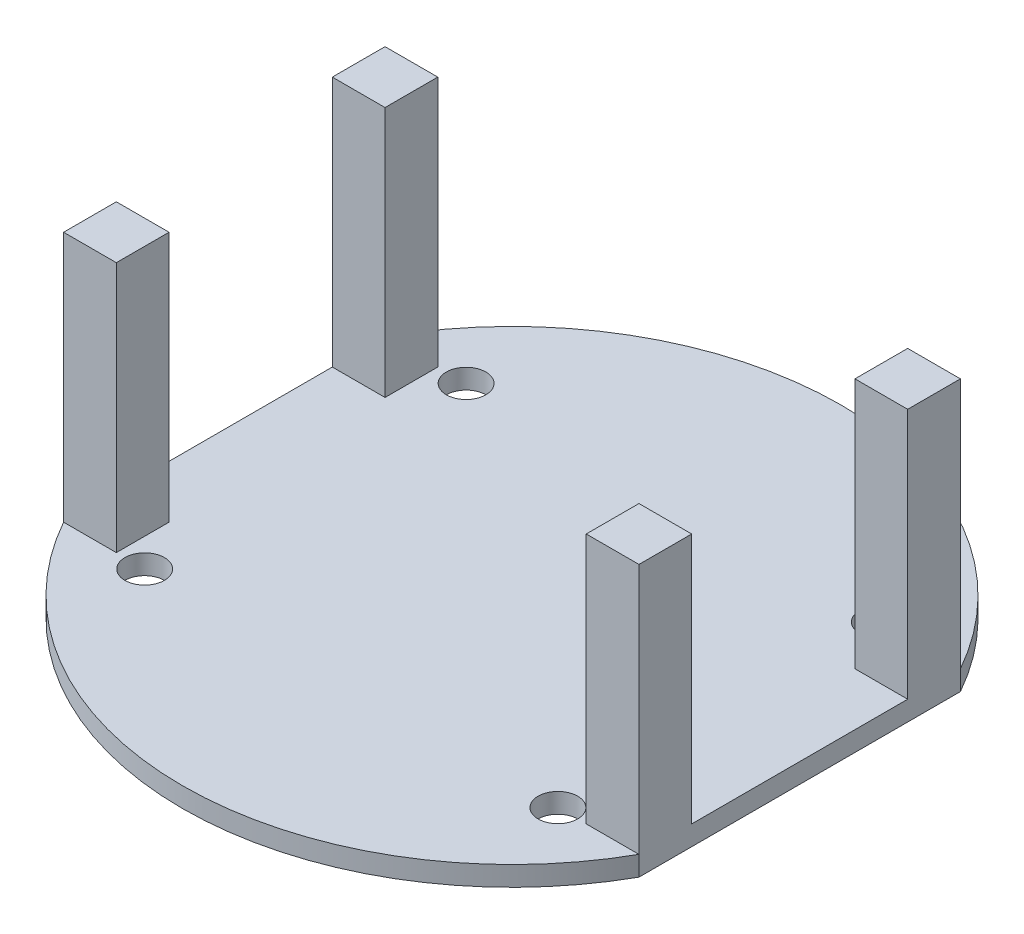
ISO-10303-21;
HEADER;
FILE_DESCRIPTION(('STEP AP214'),'2;1');
FILE_NAME('part.step','',(''),(''),'','','');
FILE_SCHEMA(('AUTOMOTIVE_DESIGN { 1 0 10303 214 1 1 1 1 }'));
ENDSEC;
DATA;
#1=APPLICATION_CONTEXT('core data for automotive mechanical design processes');
#2=APPLICATION_PROTOCOL_DEFINITION('international standard','automotive_design',2000,#1);
#3=PRODUCT_CONTEXT('',#1,'mechanical');
#4=PRODUCT('Part','Part','',(#3));
#5=PRODUCT_RELATED_PRODUCT_CATEGORY('part','',(#4));
#6=PRODUCT_DEFINITION_FORMATION('','',#4);
#7=PRODUCT_DEFINITION_CONTEXT('part definition',#1,'design');
#8=PRODUCT_DEFINITION('design','',#6,#7);
#9=PRODUCT_DEFINITION_SHAPE('','',#8);
#10=(LENGTH_UNIT() NAMED_UNIT(*) SI_UNIT(.MILLI.,.METRE.));
#11=(NAMED_UNIT(*) PLANE_ANGLE_UNIT() SI_UNIT($,.RADIAN.));
#12=(NAMED_UNIT(*) SI_UNIT($,.STERADIAN.) SOLID_ANGLE_UNIT());
#13=UNCERTAINTY_MEASURE_WITH_UNIT(LENGTH_MEASURE(1.E-05),#10,'distance_accuracy_value','');
#14=(GEOMETRIC_REPRESENTATION_CONTEXT(3) GLOBAL_UNCERTAINTY_ASSIGNED_CONTEXT((#13)) GLOBAL_UNIT_ASSIGNED_CONTEXT((#10,
#11,#12)) REPRESENTATION_CONTEXT('',''));
#15=CARTESIAN_POINT('',(0.,0.,0.));
#16=DIRECTION('',(0.,0.,1.));
#17=DIRECTION('',(1.,0.,0.));
#18=AXIS2_PLACEMENT_3D('',#15,#16,#17);
#19=CARTESIAN_POINT('',(0.,3.,0.));
#20=DIRECTION('',(0.,1.,0.));
#21=DIRECTION('',(0.,0.,1.));
#22=AXIS2_PLACEMENT_3D('',#19,#20,#21);
#23=PLANE('',#22);
#24=CARTESIAN_POINT('',(31.3499999999997,3.,24.3860103337959));
#25=DIRECTION('',(0.,1.,0.));
#26=DIRECTION('',(0.,0.,1.));
#27=AXIS2_PLACEMENT_3D('',#24,#25,#26);
#28=CIRCLE('',#27,3.);
#29=CARTESIAN_POINT('',(31.3499999999997,3.,27.3860103337959));
#30=VERTEX_POINT('',#29);
#31=EDGE_CURVE('E389',#30,#30,#28,.F.);
#32=ORIENTED_EDGE('',*,*,#31,.T.);
#33=EDGE_LOOP('',(#32));
#34=FACE_BOUND('',#33,.T.);
#35=CARTESIAN_POINT('',(31.3499999999997,3.,-24.3860103337959));
#36=DIRECTION('',(0.,1.,0.));
#37=DIRECTION('',(0.,0.,1.));
#38=AXIS2_PLACEMENT_3D('',#35,#36,#37);
#39=CIRCLE('',#38,3.);
#40=CARTESIAN_POINT('',(31.3499999999997,3.,-21.3860103337959));
#41=VERTEX_POINT('',#40);
#42=EDGE_CURVE('E582',#41,#41,#39,.F.);
#43=ORIENTED_EDGE('',*,*,#42,.T.);
#44=EDGE_LOOP('',(#43));
#45=FACE_BOUND('',#44,.T.);
#46=CARTESIAN_POINT('',(-31.3500000000001,3.,-24.3860103337959));
#47=DIRECTION('',(0.,1.,0.));
#48=DIRECTION('',(0.,0.,1.));
#49=AXIS2_PLACEMENT_3D('',#46,#47,#48);
#50=CIRCLE('',#49,3.);
#51=CARTESIAN_POINT('',(-31.3500000000001,3.,-21.3860103337959));
#52=VERTEX_POINT('',#51);
#53=EDGE_CURVE('E381',#52,#52,#50,.F.);
#54=ORIENTED_EDGE('',*,*,#53,.T.);
#55=EDGE_LOOP('',(#54));
#56=FACE_BOUND('',#55,.T.);
#57=CARTESIAN_POINT('',(-31.3500000000001,3.,24.3860103337959));
#58=DIRECTION('',(0.,1.,0.));
#59=DIRECTION('',(0.,0.,1.));
#60=AXIS2_PLACEMENT_3D('',#57,#58,#59);
#61=CIRCLE('',#60,3.);
#62=CARTESIAN_POINT('',(-31.3500000000001,3.,27.3860103337959));
#63=VERTEX_POINT('',#62);
#64=EDGE_CURVE('E380',#63,#63,#61,.F.);
#65=ORIENTED_EDGE('',*,*,#64,.T.);
#66=EDGE_LOOP('',(#65));
#67=FACE_BOUND('',#66,.T.);
#68=DIRECTION('',(0.,0.,1.));
#69=VECTOR('',#68,1.);
#70=CARTESIAN_POINT('',(35.65,3.,24.3860103337959));
#71=LINE('',#70,#69);
#72=CARTESIAN_POINT('',(35.65,3.,16.3860103337959));
#73=VERTEX_POINT('',#72);
#74=CARTESIAN_POINT('',(35.65,3.,24.3860103337959));
#75=VERTEX_POINT('',#74);
#76=EDGE_CURVE('E396',#73,#75,#71,.T.);
#77=ORIENTED_EDGE('',*,*,#76,.F.);
#78=DIRECTION('',(-1.,0.,0.));
#79=VECTOR('',#78,1.);
#80=CARTESIAN_POINT('',(43.65,3.,16.3860103337959));
#81=LINE('',#80,#79);
#82=CARTESIAN_POINT('',(43.65,3.,16.3860103337959));
#83=VERTEX_POINT('',#82);
#84=EDGE_CURVE('E384',#83,#73,#81,.T.);
#85=ORIENTED_EDGE('',*,*,#84,.F.);
#86=DIRECTION('',(0.,0.,1.));
#87=VECTOR('',#86,1.);
#88=CARTESIAN_POINT('',(43.65,3.,-24.3860103337959));
#89=LINE('',#88,#87);
#90=CARTESIAN_POINT('',(43.65,3.,-16.3860103337959));
#91=VERTEX_POINT('',#90);
#92=EDGE_CURVE('E182',#91,#83,#89,.T.);
#93=ORIENTED_EDGE('',*,*,#92,.F.);
#94=DIRECTION('',(1.,0.,0.));
#95=VECTOR('',#94,1.);
#96=CARTESIAN_POINT('',(43.65,3.,-16.3860103337959));
#97=LINE('',#96,#95);
#98=CARTESIAN_POINT('',(35.65,3.,-16.3860103337959));
#99=VERTEX_POINT('',#98);
#100=EDGE_CURVE('E195',#99,#91,#97,.T.);
#101=ORIENTED_EDGE('',*,*,#100,.F.);
#102=DIRECTION('',(0.,0.,1.));
#103=VECTOR('',#102,1.);
#104=CARTESIAN_POINT('',(35.65,3.,-24.3860103337959));
#105=LINE('',#104,#103);
#106=CARTESIAN_POINT('',(35.65,3.,-24.3860103337959));
#107=VERTEX_POINT('',#106);
#108=EDGE_CURVE('E185',#107,#99,#105,.T.);
#109=ORIENTED_EDGE('',*,*,#108,.F.);
#110=DIRECTION('',(-1.,0.,0.));
#111=VECTOR('',#110,1.);
#112=CARTESIAN_POINT('',(43.65,3.,-24.3860103337959));
#113=LINE('',#112,#111);
#114=CARTESIAN_POINT('',(43.65,3.,-24.3860103337959));
#115=VERTEX_POINT('',#114);
#116=EDGE_CURVE('E183',#115,#107,#113,.T.);
#117=ORIENTED_EDGE('',*,*,#116,.F.);
#118=CARTESIAN_POINT('',(0.,3.,0.));
#119=DIRECTION('',(0.,1.,0.));
#120=DIRECTION('',(0.,0.,1.));
#121=AXIS2_PLACEMENT_3D('',#118,#119,#120);
#122=CIRCLE('',#121,50.);
#123=CARTESIAN_POINT('',(-43.65,3.,-24.3860103337959));
#124=VERTEX_POINT('',#123);
#125=EDGE_CURVE('E284',#115,#124,#122,.T.);
#126=ORIENTED_EDGE('',*,*,#125,.T.);
#127=DIRECTION('',(-1.,0.,0.));
#128=VECTOR('',#127,1.);
#129=CARTESIAN_POINT('',(-43.65,3.,-24.3860103337959));
#130=LINE('',#129,#128);
#131=CARTESIAN_POINT('',(-35.65,3.,-24.3860103337959));
#132=VERTEX_POINT('',#131);
#133=EDGE_CURVE('E217',#132,#124,#130,.T.);
#134=ORIENTED_EDGE('',*,*,#133,.F.);
#135=DIRECTION('',(0.,0.,-1.));
#136=VECTOR('',#135,1.);
#137=CARTESIAN_POINT('',(-35.65,3.,-24.3860103337959));
#138=LINE('',#137,#136);
#139=CARTESIAN_POINT('',(-35.65,3.,-16.3860103337959));
#140=VERTEX_POINT('',#139);
#141=EDGE_CURVE('E225',#140,#132,#138,.T.);
#142=ORIENTED_EDGE('',*,*,#141,.F.);
#143=DIRECTION('',(1.,0.,0.));
#144=VECTOR('',#143,1.);
#145=CARTESIAN_POINT('',(-43.65,3.,-16.3860103337959));
#146=LINE('',#145,#144);
#147=CARTESIAN_POINT('',(-43.65,3.,-16.3860103337959));
#148=VERTEX_POINT('',#147);
#149=EDGE_CURVE('E212',#148,#140,#146,.T.);
#150=ORIENTED_EDGE('',*,*,#149,.F.);
#151=DIRECTION('',(0.,0.,-1.));
#152=VECTOR('',#151,1.);
#153=CARTESIAN_POINT('',(-43.65,3.,-24.3860103337959));
#154=LINE('',#153,#152);
#155=CARTESIAN_POINT('',(-43.65,3.,16.3860103337959));
#156=VERTEX_POINT('',#155);
#157=EDGE_CURVE('E265',#156,#148,#154,.T.);
#158=ORIENTED_EDGE('',*,*,#157,.F.);
#159=DIRECTION('',(-1.,0.,0.));
#160=VECTOR('',#159,1.);
#161=CARTESIAN_POINT('',(-43.65,3.,16.3860103337959));
#162=LINE('',#161,#160);
#163=CARTESIAN_POINT('',(-35.65,3.,16.3860103337959));
#164=VERTEX_POINT('',#163);
#165=EDGE_CURVE('E56',#164,#156,#162,.T.);
#166=ORIENTED_EDGE('',*,*,#165,.F.);
#167=DIRECTION('',(0.,0.,-1.));
#168=VECTOR('',#167,1.);
#169=CARTESIAN_POINT('',(-35.65,3.,24.3860103337959));
#170=LINE('',#169,#168);
#171=CARTESIAN_POINT('',(-35.65,3.,24.3860103337959));
#172=VERTEX_POINT('',#171);
#173=EDGE_CURVE('E251',#172,#164,#170,.T.);
#174=ORIENTED_EDGE('',*,*,#173,.F.);
#175=DIRECTION('',(1.,0.,0.));
#176=VECTOR('',#175,1.);
#177=CARTESIAN_POINT('',(-43.65,3.,24.3860103337959));
#178=LINE('',#177,#176);
#179=CARTESIAN_POINT('',(-43.65,3.,24.3860103337959));
#180=VERTEX_POINT('',#179);
#181=EDGE_CURVE('E238',#180,#172,#178,.T.);
#182=ORIENTED_EDGE('',*,*,#181,.F.);
#183=CARTESIAN_POINT('',(43.65,3.,24.3860103337959));
#184=VERTEX_POINT('',#183);
#185=EDGE_CURVE('E281',#180,#184,#122,.T.);
#186=ORIENTED_EDGE('',*,*,#185,.T.);
#187=DIRECTION('',(1.,0.,0.));
#188=VECTOR('',#187,1.);
#189=CARTESIAN_POINT('',(43.65,3.,24.3860103337959));
#190=LINE('',#189,#188);
#191=EDGE_CURVE('E177',#75,#184,#190,.T.);
#192=ORIENTED_EDGE('',*,*,#191,.F.);
#193=EDGE_LOOP('',(#77,#85,#93,#101,#109,#117,#126,#134,#142,#150,#158,#166,#174,#182,#186,#192));
#194=FACE_BOUND('',#193,.T.);
#195=ADVANCED_FACE('F33',(#34,#45,#56,#67,#194),#23,.T.);
#196=CARTESIAN_POINT('',(0.,3.,0.));
#197=DIRECTION('',(0.,-1.,0.));
#198=DIRECTION('',(0.,0.,-1.));
#199=AXIS2_PLACEMENT_3D('',#196,#197,#198);
#200=CYLINDRICAL_SURFACE('',#199,50.);
#201=CARTESIAN_POINT('',(0.,0.,0.));
#202=DIRECTION('',(0.,1.,0.));
#203=DIRECTION('',(0.,0.,1.));
#204=AXIS2_PLACEMENT_3D('',#201,#202,#203);
#205=CIRCLE('',#204,50.);
#206=CARTESIAN_POINT('',(43.65,0.,-24.3860103337959));
#207=VERTEX_POINT('',#206);
#208=CARTESIAN_POINT('',(-43.65,0.,-24.3860103337959));
#209=VERTEX_POINT('',#208);
#210=EDGE_CURVE('E285',#207,#209,#205,.T.);
#211=ORIENTED_EDGE('',*,*,#210,.T.);
#212=DIRECTION('',(0.,1.,0.));
#213=VECTOR('',#212,1.);
#214=CARTESIAN_POINT('',(-43.65,-35.1,-24.3860103337959));
#215=LINE('',#214,#213);
#216=EDGE_CURVE('E270',#209,#124,#215,.T.);
#217=ORIENTED_EDGE('',*,*,#216,.T.);
#218=ORIENTED_EDGE('',*,*,#125,.F.);
#219=DIRECTION('',(0.,1.,0.));
#220=VECTOR('',#219,1.);
#221=CARTESIAN_POINT('',(43.65,-35.1,-24.3860103337959));
#222=LINE('',#221,#220);
#223=EDGE_CURVE('E277',#207,#115,#222,.T.);
#224=ORIENTED_EDGE('',*,*,#223,.F.);
#225=EDGE_LOOP('',(#211,#217,#218,#224));
#226=FACE_BOUND('',#225,.T.);
#227=ADVANCED_FACE('F301',(#226),#200,.T.);
#228=ORIENTED_EDGE('',*,*,#185,.F.);
#229=DIRECTION('',(0.,1.,0.));
#230=VECTOR('',#229,1.);
#231=CARTESIAN_POINT('',(-43.65,-35.1,24.3860103337959));
#232=LINE('',#231,#230);
#233=CARTESIAN_POINT('',(-43.65,0.,24.3860103337959));
#234=VERTEX_POINT('',#233);
#235=EDGE_CURVE('E268',#234,#180,#232,.T.);
#236=ORIENTED_EDGE('',*,*,#235,.F.);
#237=CARTESIAN_POINT('',(43.65,0.,24.3860103337959));
#238=VERTEX_POINT('',#237);
#239=EDGE_CURVE('E273',#234,#238,#205,.T.);
#240=ORIENTED_EDGE('',*,*,#239,.T.);
#241=DIRECTION('',(0.,1.,0.));
#242=VECTOR('',#241,1.);
#243=CARTESIAN_POINT('',(43.65,-35.1,24.3860103337959));
#244=LINE('',#243,#242);
#245=EDGE_CURVE('E269',#238,#184,#244,.T.);
#246=ORIENTED_EDGE('',*,*,#245,.T.);
#247=EDGE_LOOP('',(#228,#236,#240,#246));
#248=FACE_BOUND('',#247,.T.);
#249=ADVANCED_FACE('F35',(#248),#200,.T.);
#250=CARTESIAN_POINT('',(0.,0.,0.));
#251=DIRECTION('',(0.,1.,0.));
#252=DIRECTION('',(0.,0.,1.));
#253=AXIS2_PLACEMENT_3D('',#250,#251,#252);
#254=PLANE('',#253);
#255=CARTESIAN_POINT('',(31.3499999999997,0.,24.3860103337959));
#256=DIRECTION('',(0.,-1.,0.));
#257=DIRECTION('',(0.,0.,-1.));
#258=AXIS2_PLACEMENT_3D('',#255,#256,#257);
#259=CIRCLE('',#258,3.);
#260=CARTESIAN_POINT('',(31.3499999999997,0.,21.3860103337959));
#261=VERTEX_POINT('',#260);
#262=EDGE_CURVE('E367',#261,#261,#259,.T.);
#263=ORIENTED_EDGE('',*,*,#262,.F.);
#264=EDGE_LOOP('',(#263));
#265=FACE_BOUND('',#264,.T.);
#266=CARTESIAN_POINT('',(31.3499999999997,0.,-24.3860103337959));
#267=DIRECTION('',(0.,-1.,0.));
#268=DIRECTION('',(0.,0.,-1.));
#269=AXIS2_PLACEMENT_3D('',#266,#267,#268);
#270=CIRCLE('',#269,3.);
#271=CARTESIAN_POINT('',(31.3499999999997,0.,-27.3860103337959));
#272=VERTEX_POINT('',#271);
#273=EDGE_CURVE('E371',#272,#272,#270,.T.);
#274=ORIENTED_EDGE('',*,*,#273,.F.);
#275=EDGE_LOOP('',(#274));
#276=FACE_BOUND('',#275,.T.);
#277=CARTESIAN_POINT('',(-31.3500000000001,0.,-24.3860103337959));
#278=DIRECTION('',(0.,-1.,0.));
#279=DIRECTION('',(0.,0.,-1.));
#280=AXIS2_PLACEMENT_3D('',#277,#278,#279);
#281=CIRCLE('',#280,3.);
#282=CARTESIAN_POINT('',(-31.3500000000001,0.,-27.3860103337959));
#283=VERTEX_POINT('',#282);
#284=EDGE_CURVE('E375',#283,#283,#281,.T.);
#285=ORIENTED_EDGE('',*,*,#284,.F.);
#286=EDGE_LOOP('',(#285));
#287=FACE_BOUND('',#286,.T.);
#288=CARTESIAN_POINT('',(-31.3500000000001,0.,24.3860103337959));
#289=DIRECTION('',(0.,-1.,0.));
#290=DIRECTION('',(0.,0.,-1.));
#291=AXIS2_PLACEMENT_3D('',#288,#289,#290);
#292=CIRCLE('',#291,3.);
#293=CARTESIAN_POINT('',(-31.3500000000001,0.,21.3860103337959));
#294=VERTEX_POINT('',#293);
#295=EDGE_CURVE('E378',#294,#294,#292,.T.);
#296=ORIENTED_EDGE('',*,*,#295,.F.);
#297=EDGE_LOOP('',(#296));
#298=FACE_BOUND('',#297,.T.);
#299=ORIENTED_EDGE('',*,*,#239,.F.);
#300=DIRECTION('',(0.,0.,-1.));
#301=VECTOR('',#300,1.);
#302=CARTESIAN_POINT('',(-43.65,0.,0.));
#303=LINE('',#302,#301);
#304=EDGE_CURVE('E11',#234,#209,#303,.T.);
#305=ORIENTED_EDGE('',*,*,#304,.T.);
#306=ORIENTED_EDGE('',*,*,#210,.F.);
#307=DIRECTION('',(0.,0.,1.));
#308=VECTOR('',#307,1.);
#309=CARTESIAN_POINT('',(43.65,0.,0.));
#310=LINE('',#309,#308);
#311=EDGE_CURVE('E41',#207,#238,#310,.T.);
#312=ORIENTED_EDGE('',*,*,#311,.T.);
#313=EDGE_LOOP('',(#299,#305,#306,#312));
#314=FACE_BOUND('',#313,.T.);
#315=ADVANCED_FACE('F307',(#265,#276,#287,#298,#314),#254,.F.);
#316=CARTESIAN_POINT('',(43.65,-35.1,-24.3860103337959));
#317=DIRECTION('',(-1.,0.,0.));
#318=DIRECTION('',(0.,0.,1.));
#319=AXIS2_PLACEMENT_3D('',#316,#317,#318);
#320=PLANE('',#319);
#321=ORIENTED_EDGE('',*,*,#223,.T.);
#322=DIRECTION('',(0.,-1.,0.));
#323=VECTOR('',#322,1.);
#324=CARTESIAN_POINT('',(43.65,41.1,-24.3860103337959));
#325=LINE('',#324,#323);
#326=CARTESIAN_POINT('',(43.65,41.1,-24.3860103337959));
#327=VERTEX_POINT('',#326);
#328=EDGE_CURVE('E210',#327,#115,#325,.T.);
#329=ORIENTED_EDGE('',*,*,#328,.F.);
#330=DIRECTION('',(0.,0.,-1.));
#331=VECTOR('',#330,1.);
#332=CARTESIAN_POINT('',(43.65,41.1,-24.3860103337959));
#333=LINE('',#332,#331);
#334=CARTESIAN_POINT('',(43.65,41.1,-16.3860103337959));
#335=VERTEX_POINT('',#334);
#336=EDGE_CURVE('E191',#335,#327,#333,.T.);
#337=ORIENTED_EDGE('',*,*,#336,.F.);
#338=DIRECTION('',(0.,-1.,0.));
#339=VECTOR('',#338,1.);
#340=CARTESIAN_POINT('',(43.65,41.1,-16.3860103337959));
#341=LINE('',#340,#339);
#342=EDGE_CURVE('E48',#335,#91,#341,.T.);
#343=ORIENTED_EDGE('',*,*,#342,.T.);
#344=ORIENTED_EDGE('',*,*,#92,.T.);
#345=DIRECTION('',(0.,-1.,0.));
#346=VECTOR('',#345,1.);
#347=CARTESIAN_POINT('',(43.65,41.1,16.3860103337959));
#348=LINE('',#347,#346);
#349=CARTESIAN_POINT('',(43.65,41.1,16.3860103337959));
#350=VERTEX_POINT('',#349);
#351=EDGE_CURVE('E163',#350,#83,#348,.T.);
#352=ORIENTED_EDGE('',*,*,#351,.F.);
#353=DIRECTION('',(0.,0.,-1.));
#354=VECTOR('',#353,1.);
#355=CARTESIAN_POINT('',(43.65,41.1,24.3860103337959));
#356=LINE('',#355,#354);
#357=CARTESIAN_POINT('',(43.65,41.1,24.3860103337959));
#358=VERTEX_POINT('',#357);
#359=EDGE_CURVE('E170',#358,#350,#356,.T.);
#360=ORIENTED_EDGE('',*,*,#359,.F.);
#361=DIRECTION('',(0.,-1.,0.));
#362=VECTOR('',#361,1.);
#363=CARTESIAN_POINT('',(43.65,41.1,24.3860103337959));
#364=LINE('',#363,#362);
#365=EDGE_CURVE('E394',#358,#184,#364,.T.);
#366=ORIENTED_EDGE('',*,*,#365,.T.);
#367=ORIENTED_EDGE('',*,*,#245,.F.);
#368=ORIENTED_EDGE('',*,*,#311,.F.);
#369=EDGE_LOOP('',(#321,#329,#337,#343,#344,#352,#360,#366,#367,#368));
#370=FACE_BOUND('',#369,.T.);
#371=ADVANCED_FACE('F180',(#370),#320,.F.);
#372=CARTESIAN_POINT('',(-43.65,-35.1,-24.3860103337959));
#373=DIRECTION('',(1.,0.,0.));
#374=DIRECTION('',(0.,0.,-1.));
#375=AXIS2_PLACEMENT_3D('',#372,#373,#374);
#376=PLANE('',#375);
#377=ORIENTED_EDGE('',*,*,#235,.T.);
#378=DIRECTION('',(0.,-1.,0.));
#379=VECTOR('',#378,1.);
#380=CARTESIAN_POINT('',(-43.65,41.1,24.3860103337959));
#381=LINE('',#380,#379);
#382=CARTESIAN_POINT('',(-43.65,41.1,24.3860103337959));
#383=VERTEX_POINT('',#382);
#384=EDGE_CURVE('E262',#383,#180,#381,.T.);
#385=ORIENTED_EDGE('',*,*,#384,.F.);
#386=DIRECTION('',(0.,0.,1.));
#387=VECTOR('',#386,1.);
#388=CARTESIAN_POINT('',(-43.65,41.1,24.3860103337959));
#389=LINE('',#388,#387);
#390=CARTESIAN_POINT('',(-43.65,41.1,16.3860103337959));
#391=VERTEX_POINT('',#390);
#392=EDGE_CURVE('E239',#391,#383,#389,.T.);
#393=ORIENTED_EDGE('',*,*,#392,.F.);
#394=DIRECTION('',(0.,-1.,0.));
#395=VECTOR('',#394,1.);
#396=CARTESIAN_POINT('',(-43.65,41.1,16.3860103337959));
#397=LINE('',#396,#395);
#398=EDGE_CURVE('E248',#391,#156,#397,.T.);
#399=ORIENTED_EDGE('',*,*,#398,.T.);
#400=ORIENTED_EDGE('',*,*,#157,.T.);
#401=DIRECTION('',(0.,-1.,0.));
#402=VECTOR('',#401,1.);
#403=CARTESIAN_POINT('',(-43.65,41.1,-16.3860103337959));
#404=LINE('',#403,#402);
#405=CARTESIAN_POINT('',(-43.65,41.1,-16.3860103337959));
#406=VERTEX_POINT('',#405);
#407=EDGE_CURVE('E236',#406,#148,#404,.T.);
#408=ORIENTED_EDGE('',*,*,#407,.F.);
#409=DIRECTION('',(0.,0.,1.));
#410=VECTOR('',#409,1.);
#411=CARTESIAN_POINT('',(-43.65,41.1,-24.3860103337959));
#412=LINE('',#411,#410);
#413=CARTESIAN_POINT('',(-43.65,41.1,-24.3860103337959));
#414=VERTEX_POINT('',#413);
#415=EDGE_CURVE('E213',#414,#406,#412,.T.);
#416=ORIENTED_EDGE('',*,*,#415,.F.);
#417=DIRECTION('',(0.,-1.,0.));
#418=VECTOR('',#417,1.);
#419=CARTESIAN_POINT('',(-43.65,41.1,-24.3860103337959));
#420=LINE('',#419,#418);
#421=EDGE_CURVE('E223',#414,#124,#420,.T.);
#422=ORIENTED_EDGE('',*,*,#421,.T.);
#423=ORIENTED_EDGE('',*,*,#216,.F.);
#424=ORIENTED_EDGE('',*,*,#304,.F.);
#425=EDGE_LOOP('',(#377,#385,#393,#399,#400,#408,#416,#422,#423,#424));
#426=FACE_BOUND('',#425,.T.);
#427=ADVANCED_FACE('F303',(#426),#376,.F.);
#428=CARTESIAN_POINT('',(-43.65,41.1,24.3860103337959));
#429=DIRECTION('',(0.,0.,-1.));
#430=DIRECTION('',(-1.,0.,0.));
#431=AXIS2_PLACEMENT_3D('',#428,#429,#430);
#432=PLANE('',#431);
#433=ORIENTED_EDGE('',*,*,#181,.T.);
#434=DIRECTION('',(0.,-1.,0.));
#435=VECTOR('',#434,1.);
#436=CARTESIAN_POINT('',(-35.65,41.1,24.3860103337959));
#437=LINE('',#436,#435);
#438=CARTESIAN_POINT('',(-35.65,41.1,24.3860103337959));
#439=VERTEX_POINT('',#438);
#440=EDGE_CURVE('E259',#439,#172,#437,.T.);
#441=ORIENTED_EDGE('',*,*,#440,.F.);
#442=DIRECTION('',(1.,0.,0.));
#443=VECTOR('',#442,1.);
#444=CARTESIAN_POINT('',(-43.65,41.1,24.3860103337959));
#445=LINE('',#444,#443);
#446=EDGE_CURVE('E242',#383,#439,#445,.T.);
#447=ORIENTED_EDGE('',*,*,#446,.F.);
#448=ORIENTED_EDGE('',*,*,#384,.T.);
#449=EDGE_LOOP('',(#433,#441,#447,#448));
#450=FACE_BOUND('',#449,.T.);
#451=ADVANCED_FACE('F313',(#450),#432,.F.);
#452=CARTESIAN_POINT('',(-35.65,41.1,24.3860103337959));
#453=DIRECTION('',(-1.,0.,0.));
#454=DIRECTION('',(0.,0.,1.));
#455=AXIS2_PLACEMENT_3D('',#452,#453,#454);
#456=PLANE('',#455);
#457=ORIENTED_EDGE('',*,*,#173,.T.);
#458=DIRECTION('',(0.,-1.,0.));
#459=VECTOR('',#458,1.);
#460=CARTESIAN_POINT('',(-35.65,41.1,16.3860103337959));
#461=LINE('',#460,#459);
#462=CARTESIAN_POINT('',(-35.65,41.1,16.3860103337959));
#463=VERTEX_POINT('',#462);
#464=EDGE_CURVE('E256',#463,#164,#461,.T.);
#465=ORIENTED_EDGE('',*,*,#464,.F.);
#466=DIRECTION('',(0.,0.,-1.));
#467=VECTOR('',#466,1.);
#468=CARTESIAN_POINT('',(-35.65,41.1,24.3860103337959));
#469=LINE('',#468,#467);
#470=EDGE_CURVE('E244',#439,#463,#469,.T.);
#471=ORIENTED_EDGE('',*,*,#470,.F.);
#472=ORIENTED_EDGE('',*,*,#440,.T.);
#473=EDGE_LOOP('',(#457,#465,#471,#472));
#474=FACE_BOUND('',#473,.T.);
#475=ADVANCED_FACE('F407',(#474),#456,.F.);
#476=CARTESIAN_POINT('',(-43.65,41.1,16.3860103337959));
#477=DIRECTION('',(0.,0.,1.));
#478=DIRECTION('',(1.,0.,0.));
#479=AXIS2_PLACEMENT_3D('',#476,#477,#478);
#480=PLANE('',#479);
#481=ORIENTED_EDGE('',*,*,#165,.T.);
#482=ORIENTED_EDGE('',*,*,#398,.F.);
#483=DIRECTION('',(-1.,0.,0.));
#484=VECTOR('',#483,1.);
#485=CARTESIAN_POINT('',(-43.65,41.1,16.3860103337959));
#486=LINE('',#485,#484);
#487=EDGE_CURVE('E246',#463,#391,#486,.T.);
#488=ORIENTED_EDGE('',*,*,#487,.F.);
#489=ORIENTED_EDGE('',*,*,#464,.T.);
#490=EDGE_LOOP('',(#481,#482,#488,#489));
#491=FACE_BOUND('',#490,.T.);
#492=ADVANCED_FACE('F322',(#491),#480,.F.);
#493=CARTESIAN_POINT('',(0.,41.1,0.));
#494=DIRECTION('',(0.,-1.,0.));
#495=DIRECTION('',(0.,0.,-1.));
#496=AXIS2_PLACEMENT_3D('',#493,#494,#495);
#497=PLANE('',#496);
#498=ORIENTED_EDGE('',*,*,#392,.T.);
#499=ORIENTED_EDGE('',*,*,#446,.T.);
#500=ORIENTED_EDGE('',*,*,#470,.T.);
#501=ORIENTED_EDGE('',*,*,#487,.T.);
#502=EDGE_LOOP('',(#498,#499,#500,#501));
#503=FACE_BOUND('',#502,.T.);
#504=ADVANCED_FACE('F317',(#503),#497,.F.);
#505=CARTESIAN_POINT('',(-43.65,41.1,-16.3860103337959));
#506=DIRECTION('',(0.,0.,-1.));
#507=DIRECTION('',(-1.,0.,0.));
#508=AXIS2_PLACEMENT_3D('',#505,#506,#507);
#509=PLANE('',#508);
#510=ORIENTED_EDGE('',*,*,#149,.T.);
#511=DIRECTION('',(0.,-1.,0.));
#512=VECTOR('',#511,1.);
#513=CARTESIAN_POINT('',(-35.65,41.1,-16.3860103337959));
#514=LINE('',#513,#512);
#515=CARTESIAN_POINT('',(-35.65,41.1,-16.3860103337959));
#516=VERTEX_POINT('',#515);
#517=EDGE_CURVE('E233',#516,#140,#514,.T.);
#518=ORIENTED_EDGE('',*,*,#517,.F.);
#519=DIRECTION('',(1.,0.,0.));
#520=VECTOR('',#519,1.);
#521=CARTESIAN_POINT('',(-43.65,41.1,-16.3860103337959));
#522=LINE('',#521,#520);
#523=EDGE_CURVE('E216',#406,#516,#522,.T.);
#524=ORIENTED_EDGE('',*,*,#523,.F.);
#525=ORIENTED_EDGE('',*,*,#407,.T.);
#526=EDGE_LOOP('',(#510,#518,#524,#525));
#527=FACE_BOUND('',#526,.T.);
#528=ADVANCED_FACE('F327',(#527),#509,.F.);
#529=CARTESIAN_POINT('',(-35.65,41.1,-24.3860103337959));
#530=DIRECTION('',(-1.,0.,0.));
#531=DIRECTION('',(0.,0.,1.));
#532=AXIS2_PLACEMENT_3D('',#529,#530,#531);
#533=PLANE('',#532);
#534=ORIENTED_EDGE('',*,*,#141,.T.);
#535=DIRECTION('',(0.,-1.,0.));
#536=VECTOR('',#535,1.);
#537=CARTESIAN_POINT('',(-35.65,41.1,-24.3860103337959));
#538=LINE('',#537,#536);
#539=CARTESIAN_POINT('',(-35.65,41.1,-24.3860103337959));
#540=VERTEX_POINT('',#539);
#541=EDGE_CURVE('E230',#540,#132,#538,.T.);
#542=ORIENTED_EDGE('',*,*,#541,.F.);
#543=DIRECTION('',(0.,0.,-1.));
#544=VECTOR('',#543,1.);
#545=CARTESIAN_POINT('',(-35.65,41.1,-24.3860103337959));
#546=LINE('',#545,#544);
#547=EDGE_CURVE('E219',#516,#540,#546,.T.);
#548=ORIENTED_EDGE('',*,*,#547,.F.);
#549=ORIENTED_EDGE('',*,*,#517,.T.);
#550=EDGE_LOOP('',(#534,#542,#548,#549));
#551=FACE_BOUND('',#550,.T.);
#552=ADVANCED_FACE('F330',(#551),#533,.F.);
#553=CARTESIAN_POINT('',(-43.65,41.1,-24.3860103337959));
#554=DIRECTION('',(0.,0.,1.));
#555=DIRECTION('',(1.,0.,0.));
#556=AXIS2_PLACEMENT_3D('',#553,#554,#555);
#557=PLANE('',#556);
#558=ORIENTED_EDGE('',*,*,#133,.T.);
#559=ORIENTED_EDGE('',*,*,#421,.F.);
#560=DIRECTION('',(-1.,0.,0.));
#561=VECTOR('',#560,1.);
#562=CARTESIAN_POINT('',(-43.65,41.1,-24.3860103337959));
#563=LINE('',#562,#561);
#564=EDGE_CURVE('E221',#540,#414,#563,.T.);
#565=ORIENTED_EDGE('',*,*,#564,.F.);
#566=ORIENTED_EDGE('',*,*,#541,.T.);
#567=EDGE_LOOP('',(#558,#559,#565,#566));
#568=FACE_BOUND('',#567,.T.);
#569=ADVANCED_FACE('F336',(#568),#557,.F.);
#570=CARTESIAN_POINT('',(0.,41.1,0.));
#571=DIRECTION('',(0.,1.,0.));
#572=DIRECTION('',(0.,0.,1.));
#573=AXIS2_PLACEMENT_3D('',#570,#571,#572);
#574=PLANE('',#573);
#575=ORIENTED_EDGE('',*,*,#415,.T.);
#576=ORIENTED_EDGE('',*,*,#523,.T.);
#577=ORIENTED_EDGE('',*,*,#547,.T.);
#578=ORIENTED_EDGE('',*,*,#564,.T.);
#579=EDGE_LOOP('',(#575,#576,#577,#578));
#580=FACE_BOUND('',#579,.T.);
#581=ADVANCED_FACE('F334',(#580),#574,.T.);
#582=CARTESIAN_POINT('',(43.65,41.1,-24.3860103337959));
#583=DIRECTION('',(0.,0.,1.));
#584=DIRECTION('',(1.,0.,0.));
#585=AXIS2_PLACEMENT_3D('',#582,#583,#584);
#586=PLANE('',#585);
#587=ORIENTED_EDGE('',*,*,#116,.T.);
#588=DIRECTION('',(0.,-1.,0.));
#589=VECTOR('',#588,1.);
#590=CARTESIAN_POINT('',(35.65,41.1,-24.3860103337959));
#591=LINE('',#590,#589);
#592=CARTESIAN_POINT('',(35.65,41.1,-24.3860103337959));
#593=VERTEX_POINT('',#592);
#594=EDGE_CURVE('E207',#593,#107,#591,.T.);
#595=ORIENTED_EDGE('',*,*,#594,.F.);
#596=DIRECTION('',(-1.,0.,0.));
#597=VECTOR('',#596,1.);
#598=CARTESIAN_POINT('',(43.65,41.1,-24.3860103337959));
#599=LINE('',#598,#597);
#600=EDGE_CURVE('E194',#327,#593,#599,.T.);
#601=ORIENTED_EDGE('',*,*,#600,.F.);
#602=ORIENTED_EDGE('',*,*,#328,.T.);
#603=EDGE_LOOP('',(#587,#595,#601,#602));
#604=FACE_BOUND('',#603,.T.);
#605=ADVANCED_FACE('F343',(#604),#586,.F.);
#606=CARTESIAN_POINT('',(35.65,41.1,-24.3860103337959));
#607=DIRECTION('',(1.,0.,0.));
#608=DIRECTION('',(0.,0.,-1.));
#609=AXIS2_PLACEMENT_3D('',#606,#607,#608);
#610=PLANE('',#609);
#611=ORIENTED_EDGE('',*,*,#108,.T.);
#612=DIRECTION('',(0.,-1.,0.));
#613=VECTOR('',#612,1.);
#614=CARTESIAN_POINT('',(35.65,41.1,-16.3860103337959));
#615=LINE('',#614,#613);
#616=CARTESIAN_POINT('',(35.65,41.1,-16.3860103337959));
#617=VERTEX_POINT('',#616);
#618=EDGE_CURVE('E204',#617,#99,#615,.T.);
#619=ORIENTED_EDGE('',*,*,#618,.F.);
#620=DIRECTION('',(0.,0.,1.));
#621=VECTOR('',#620,1.);
#622=CARTESIAN_POINT('',(35.65,41.1,-24.3860103337959));
#623=LINE('',#622,#621);
#624=EDGE_CURVE('E197',#593,#617,#623,.T.);
#625=ORIENTED_EDGE('',*,*,#624,.F.);
#626=ORIENTED_EDGE('',*,*,#594,.T.);
#627=EDGE_LOOP('',(#611,#619,#625,#626));
#628=FACE_BOUND('',#627,.T.);
#629=ADVANCED_FACE('F476',(#628),#610,.F.);
#630=CARTESIAN_POINT('',(43.65,41.1,-16.3860103337959));
#631=DIRECTION('',(0.,0.,-1.));
#632=DIRECTION('',(-1.,0.,0.));
#633=AXIS2_PLACEMENT_3D('',#630,#631,#632);
#634=PLANE('',#633);
#635=ORIENTED_EDGE('',*,*,#100,.T.);
#636=ORIENTED_EDGE('',*,*,#342,.F.);
#637=DIRECTION('',(1.,0.,0.));
#638=VECTOR('',#637,1.);
#639=CARTESIAN_POINT('',(43.65,41.1,-16.3860103337959));
#640=LINE('',#639,#638);
#641=EDGE_CURVE('E199',#617,#335,#640,.T.);
#642=ORIENTED_EDGE('',*,*,#641,.F.);
#643=ORIENTED_EDGE('',*,*,#618,.T.);
#644=EDGE_LOOP('',(#635,#636,#642,#643));
#645=FACE_BOUND('',#644,.T.);
#646=ADVANCED_FACE('F486',(#645),#634,.F.);
#647=CARTESIAN_POINT('',(0.,41.1,0.));
#648=DIRECTION('',(0.,-1.,0.));
#649=DIRECTION('',(0.,0.,-1.));
#650=AXIS2_PLACEMENT_3D('',#647,#648,#649);
#651=PLANE('',#650);
#652=ORIENTED_EDGE('',*,*,#336,.T.);
#653=ORIENTED_EDGE('',*,*,#600,.T.);
#654=ORIENTED_EDGE('',*,*,#624,.T.);
#655=ORIENTED_EDGE('',*,*,#641,.T.);
#656=EDGE_LOOP('',(#652,#653,#654,#655));
#657=FACE_BOUND('',#656,.T.);
#658=ADVANCED_FACE('F496',(#657),#651,.F.);
#659=CARTESIAN_POINT('',(43.65,41.1,16.3860103337959));
#660=DIRECTION('',(0.,0.,1.));
#661=DIRECTION('',(1.,0.,0.));
#662=AXIS2_PLACEMENT_3D('',#659,#660,#661);
#663=PLANE('',#662);
#664=ORIENTED_EDGE('',*,*,#84,.T.);
#665=DIRECTION('',(0.,-1.,0.));
#666=VECTOR('',#665,1.);
#667=CARTESIAN_POINT('',(35.65,41.1,16.3860103337959));
#668=LINE('',#667,#666);
#669=CARTESIAN_POINT('',(35.65,41.1,16.3860103337959));
#670=VERTEX_POINT('',#669);
#671=EDGE_CURVE('E166',#670,#73,#668,.T.);
#672=ORIENTED_EDGE('',*,*,#671,.F.);
#673=DIRECTION('',(-1.,0.,0.));
#674=VECTOR('',#673,1.);
#675=CARTESIAN_POINT('',(43.65,41.1,16.3860103337959));
#676=LINE('',#675,#674);
#677=EDGE_CURVE('E159',#350,#670,#676,.T.);
#678=ORIENTED_EDGE('',*,*,#677,.F.);
#679=ORIENTED_EDGE('',*,*,#351,.T.);
#680=EDGE_LOOP('',(#664,#672,#678,#679));
#681=FACE_BOUND('',#680,.T.);
#682=ADVANCED_FACE('F161',(#681),#663,.F.);
#683=CARTESIAN_POINT('',(35.65,41.1,24.3860103337959));
#684=DIRECTION('',(1.,0.,0.));
#685=DIRECTION('',(0.,0.,-1.));
#686=AXIS2_PLACEMENT_3D('',#683,#684,#685);
#687=PLANE('',#686);
#688=ORIENTED_EDGE('',*,*,#76,.T.);
#689=DIRECTION('',(0.,-1.,0.));
#690=VECTOR('',#689,1.);
#691=CARTESIAN_POINT('',(35.65,41.1,24.3860103337959));
#692=LINE('',#691,#690);
#693=CARTESIAN_POINT('',(35.65,41.1,24.3860103337959));
#694=VERTEX_POINT('',#693);
#695=EDGE_CURVE('E187',#694,#75,#692,.T.);
#696=ORIENTED_EDGE('',*,*,#695,.F.);
#697=DIRECTION('',(0.,0.,1.));
#698=VECTOR('',#697,1.);
#699=CARTESIAN_POINT('',(35.65,41.1,24.3860103337959));
#700=LINE('',#699,#698);
#701=EDGE_CURVE('E169',#670,#694,#700,.T.);
#702=ORIENTED_EDGE('',*,*,#701,.F.);
#703=ORIENTED_EDGE('',*,*,#671,.T.);
#704=EDGE_LOOP('',(#688,#696,#702,#703));
#705=FACE_BOUND('',#704,.T.);
#706=ADVANCED_FACE('F515',(#705),#687,.F.);
#707=CARTESIAN_POINT('',(43.65,41.1,24.3860103337959));
#708=DIRECTION('',(0.,0.,-1.));
#709=DIRECTION('',(-1.,0.,0.));
#710=AXIS2_PLACEMENT_3D('',#707,#708,#709);
#711=PLANE('',#710);
#712=ORIENTED_EDGE('',*,*,#191,.T.);
#713=ORIENTED_EDGE('',*,*,#365,.F.);
#714=DIRECTION('',(1.,0.,0.));
#715=VECTOR('',#714,1.);
#716=CARTESIAN_POINT('',(43.65,41.1,24.3860103337959));
#717=LINE('',#716,#715);
#718=EDGE_CURVE('E175',#694,#358,#717,.T.);
#719=ORIENTED_EDGE('',*,*,#718,.F.);
#720=ORIENTED_EDGE('',*,*,#695,.T.);
#721=EDGE_LOOP('',(#712,#713,#719,#720));
#722=FACE_BOUND('',#721,.T.);
#723=ADVANCED_FACE('F404',(#722),#711,.F.);
#724=CARTESIAN_POINT('',(0.,41.1,0.));
#725=DIRECTION('',(0.,1.,0.));
#726=DIRECTION('',(0.,0.,1.));
#727=AXIS2_PLACEMENT_3D('',#724,#725,#726);
#728=PLANE('',#727);
#729=ORIENTED_EDGE('',*,*,#359,.T.);
#730=ORIENTED_EDGE('',*,*,#677,.T.);
#731=ORIENTED_EDGE('',*,*,#701,.T.);
#732=ORIENTED_EDGE('',*,*,#718,.T.);
#733=EDGE_LOOP('',(#729,#730,#731,#732));
#734=FACE_BOUND('',#733,.T.);
#735=ADVANCED_FACE('F173',(#734),#728,.T.);
#736=CARTESIAN_POINT('',(-31.3500000000001,11.4852813742386,24.3860103337959));
#737=DIRECTION('',(0.,-1.,0.));
#738=DIRECTION('',(0.,0.,-1.));
#739=AXIS2_PLACEMENT_3D('',#736,#737,#738);
#740=CYLINDRICAL_SURFACE('',#739,3.);
#741=ORIENTED_EDGE('',*,*,#295,.T.);
#742=EDGE_LOOP('',(#741));
#743=FACE_BOUND('',#742,.T.);
#744=ORIENTED_EDGE('',*,*,#64,.F.);
#745=EDGE_LOOP('',(#744));
#746=FACE_BOUND('',#745,.T.);
#747=ADVANCED_FACE('F538',(#743,#746),#740,.F.);
#748=CARTESIAN_POINT('',(-31.3500000000001,11.4852813742386,-24.3860103337959));
#749=DIRECTION('',(0.,-1.,0.));
#750=DIRECTION('',(0.,0.,-1.));
#751=AXIS2_PLACEMENT_3D('',#748,#749,#750);
#752=CYLINDRICAL_SURFACE('',#751,3.);
#753=ORIENTED_EDGE('',*,*,#284,.T.);
#754=EDGE_LOOP('',(#753));
#755=FACE_BOUND('',#754,.T.);
#756=ORIENTED_EDGE('',*,*,#53,.F.);
#757=EDGE_LOOP('',(#756));
#758=FACE_BOUND('',#757,.T.);
#759=ADVANCED_FACE('F547',(#755,#758),#752,.F.);
#760=CARTESIAN_POINT('',(31.3499999999997,11.4852813742386,-24.3860103337959));
#761=DIRECTION('',(0.,-1.,0.));
#762=DIRECTION('',(0.,0.,-1.));
#763=AXIS2_PLACEMENT_3D('',#760,#761,#762);
#764=CYLINDRICAL_SURFACE('',#763,3.);
#765=ORIENTED_EDGE('',*,*,#273,.T.);
#766=EDGE_LOOP('',(#765));
#767=FACE_BOUND('',#766,.T.);
#768=ORIENTED_EDGE('',*,*,#42,.F.);
#769=EDGE_LOOP('',(#768));
#770=FACE_BOUND('',#769,.T.);
#771=ADVANCED_FACE('F553',(#767,#770),#764,.F.);
#772=CARTESIAN_POINT('',(31.3499999999997,11.4852813742386,24.3860103337959));
#773=DIRECTION('',(0.,-1.,0.));
#774=DIRECTION('',(0.,0.,-1.));
#775=AXIS2_PLACEMENT_3D('',#772,#773,#774);
#776=CYLINDRICAL_SURFACE('',#775,3.);
#777=ORIENTED_EDGE('',*,*,#262,.T.);
#778=EDGE_LOOP('',(#777));
#779=FACE_BOUND('',#778,.T.);
#780=ORIENTED_EDGE('',*,*,#31,.F.);
#781=EDGE_LOOP('',(#780));
#782=FACE_BOUND('',#781,.T.);
#783=ADVANCED_FACE('F561',(#779,#782),#776,.F.);
#784=CLOSED_SHELL('',(#195,#227,#249,#315,#371,#427,#451,#475,#492,#504,#528,#552,#569,#581,
#605,#629,#646,#658,#682,#706,#723,#735,#747,#759,#771,#783));
#785=MANIFOLD_SOLID_BREP('B2',#784);
#786=ADVANCED_BREP_SHAPE_REPRESENTATION('',(#18,#785),#14);
#787=SHAPE_DEFINITION_REPRESENTATION(#9,#786);
ENDSEC;
END-ISO-10303-21;
